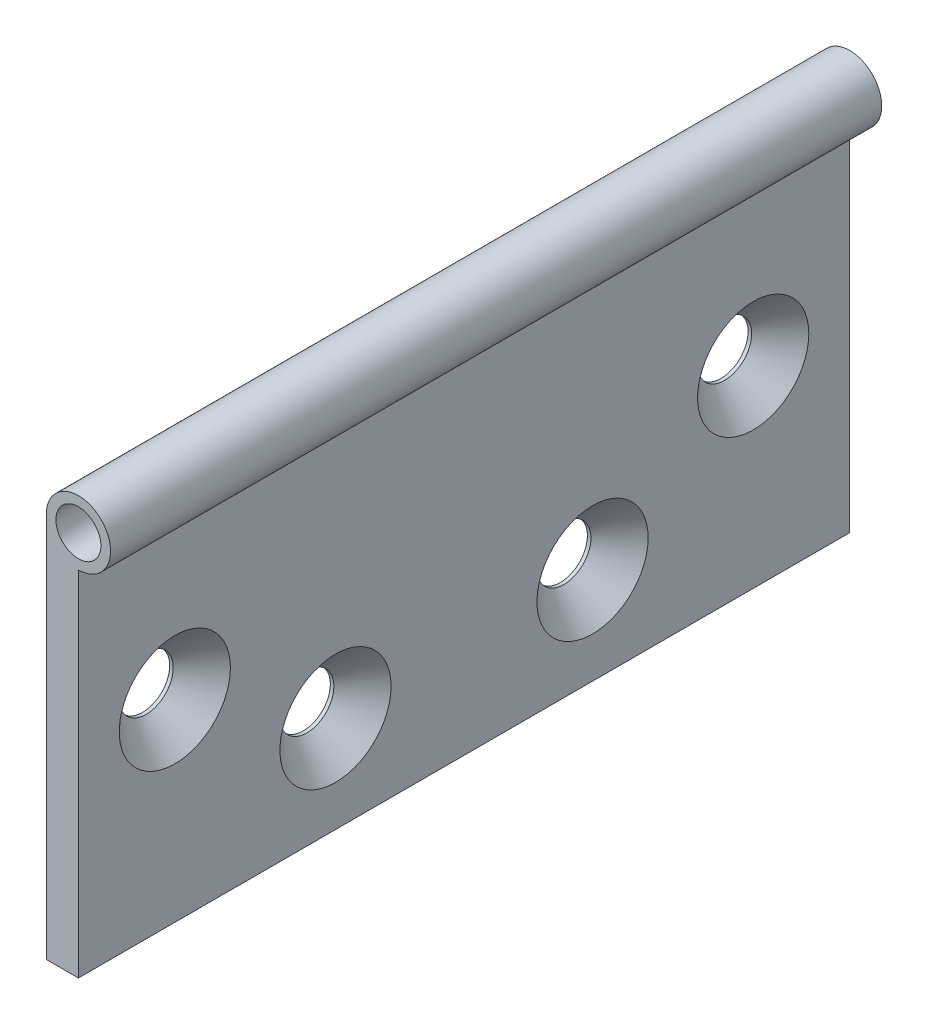
ISO-10303-21;
HEADER;
FILE_DESCRIPTION(('STEP AP214'),'2;1');
FILE_NAME('part.step','',(''),(''),'','','');
FILE_SCHEMA(('AUTOMOTIVE_DESIGN { 1 0 10303 214 1 1 1 1 }'));
ENDSEC;
DATA;
#1=APPLICATION_CONTEXT('core data for automotive mechanical design processes');
#2=APPLICATION_PROTOCOL_DEFINITION('international standard','automotive_design',2000,#1);
#3=PRODUCT_CONTEXT('',#1,'mechanical');
#4=PRODUCT('Part','Part','',(#3));
#5=PRODUCT_RELATED_PRODUCT_CATEGORY('part','',(#4));
#6=PRODUCT_DEFINITION_FORMATION('','',#4);
#7=PRODUCT_DEFINITION_CONTEXT('part definition',#1,'design');
#8=PRODUCT_DEFINITION('design','',#6,#7);
#9=PRODUCT_DEFINITION_SHAPE('','',#8);
#10=(LENGTH_UNIT() NAMED_UNIT(*) SI_UNIT(.MILLI.,.METRE.));
#11=(NAMED_UNIT(*) PLANE_ANGLE_UNIT() SI_UNIT($,.RADIAN.));
#12=(NAMED_UNIT(*) SI_UNIT($,.STERADIAN.) SOLID_ANGLE_UNIT());
#13=UNCERTAINTY_MEASURE_WITH_UNIT(LENGTH_MEASURE(1.E-05),#10,'distance_accuracy_value','');
#14=(GEOMETRIC_REPRESENTATION_CONTEXT(3) GLOBAL_UNCERTAINTY_ASSIGNED_CONTEXT((#13)) GLOBAL_UNIT_ASSIGNED_CONTEXT((#10,
#11,#12)) REPRESENTATION_CONTEXT('',''));
#15=CARTESIAN_POINT('',(0.,0.,0.));
#16=DIRECTION('',(0.,0.,1.));
#17=DIRECTION('',(1.,0.,0.));
#18=AXIS2_PLACEMENT_3D('',#15,#16,#17);
#19=CARTESIAN_POINT('',(5.,0.,60.));
#20=DIRECTION('',(-1.,0.,0.));
#21=DIRECTION('',(0.,0.,1.));
#22=AXIS2_PLACEMENT_3D('',#19,#20,#21);
#23=PLANE('',#22);
#24=CARTESIAN_POINT('',(5.,15.,-20.));
#25=DIRECTION('',(1.,0.,0.));
#26=DIRECTION('',(0.,0.,-1.));
#27=AXIS2_PLACEMENT_3D('',#24,#25,#26);
#28=CIRCLE('',#27,8.65);
#29=CARTESIAN_POINT('',(5.,15.,-28.65));
#30=VERTEX_POINT('',#29);
#31=EDGE_CURVE('E139',#30,#30,#28,.T.);
#32=ORIENTED_EDGE('',*,*,#31,.F.);
#33=EDGE_LOOP('',(#32));
#34=FACE_BOUND('',#33,.T.);
#35=CARTESIAN_POINT('',(5.,30.,-45.));
#36=DIRECTION('',(1.,0.,0.));
#37=DIRECTION('',(0.,0.,-1.));
#38=AXIS2_PLACEMENT_3D('',#35,#36,#37);
#39=CIRCLE('',#38,8.65);
#40=CARTESIAN_POINT('',(5.,30.,-53.65));
#41=VERTEX_POINT('',#40);
#42=EDGE_CURVE('E130',#41,#41,#39,.T.);
#43=ORIENTED_EDGE('',*,*,#42,.F.);
#44=EDGE_LOOP('',(#43));
#45=FACE_BOUND('',#44,.T.);
#46=CARTESIAN_POINT('',(5.,15.,20.));
#47=DIRECTION('',(1.,0.,0.));
#48=DIRECTION('',(0.,0.,-1.));
#49=AXIS2_PLACEMENT_3D('',#46,#47,#48);
#50=CIRCLE('',#49,8.65);
#51=CARTESIAN_POINT('',(5.,15.,11.35));
#52=VERTEX_POINT('',#51);
#53=EDGE_CURVE('E121',#52,#52,#50,.T.);
#54=ORIENTED_EDGE('',*,*,#53,.F.);
#55=EDGE_LOOP('',(#54));
#56=FACE_BOUND('',#55,.T.);
#57=CARTESIAN_POINT('',(5.,30.,45.));
#58=DIRECTION('',(1.,0.,0.));
#59=DIRECTION('',(0.,0.,-1.));
#60=AXIS2_PLACEMENT_3D('',#57,#58,#59);
#61=CIRCLE('',#60,8.65);
#62=CARTESIAN_POINT('',(5.,30.,36.35));
#63=VERTEX_POINT('',#62);
#64=EDGE_CURVE('E112',#63,#63,#61,.T.);
#65=ORIENTED_EDGE('',*,*,#64,.F.);
#66=EDGE_LOOP('',(#65));
#67=FACE_BOUND('',#66,.T.);
#68=DIRECTION('',(0.,0.,-1.));
#69=VECTOR('',#68,1.);
#70=CARTESIAN_POINT('',(5.,55.,60.));
#71=LINE('',#70,#69);
#72=CARTESIAN_POINT('',(5.,55.,60.));
#73=VERTEX_POINT('',#72);
#74=CARTESIAN_POINT('',(5.,55.,-60.));
#75=VERTEX_POINT('',#74);
#76=EDGE_CURVE('E83',#73,#75,#71,.T.);
#77=ORIENTED_EDGE('',*,*,#76,.F.);
#78=DIRECTION('',(0.,1.,0.));
#79=VECTOR('',#78,1.);
#80=CARTESIAN_POINT('',(5.,0.,60.));
#81=LINE('',#80,#79);
#82=CARTESIAN_POINT('',(5.,0.,60.));
#83=VERTEX_POINT('',#82);
#84=EDGE_CURVE('E71',#83,#73,#81,.T.);
#85=ORIENTED_EDGE('',*,*,#84,.F.);
#86=DIRECTION('',(0.,0.,-1.));
#87=VECTOR('',#86,1.);
#88=CARTESIAN_POINT('',(5.,0.,60.));
#89=LINE('',#88,#87);
#90=CARTESIAN_POINT('',(5.,0.,-60.));
#91=VERTEX_POINT('',#90);
#92=EDGE_CURVE('E52',#83,#91,#89,.T.);
#93=ORIENTED_EDGE('',*,*,#92,.T.);
#94=DIRECTION('',(0.,1.,0.));
#95=VECTOR('',#94,1.);
#96=CARTESIAN_POINT('',(5.,0.,-60.));
#97=LINE('',#96,#95);
#98=EDGE_CURVE('E69',#91,#75,#97,.T.);
#99=ORIENTED_EDGE('',*,*,#98,.T.);
#100=EDGE_LOOP('',(#77,#85,#93,#99));
#101=FACE_BOUND('',#100,.T.);
#102=ADVANCED_FACE('F36',(#34,#45,#56,#67,#101),#23,.F.);
#103=CARTESIAN_POINT('',(0.,0.,60.));
#104=DIRECTION('',(-1.,0.,0.));
#105=DIRECTION('',(0.,0.,1.));
#106=AXIS2_PLACEMENT_3D('',#103,#104,#105);
#107=PLANE('',#106);
#108=CARTESIAN_POINT('',(0.,15.,-20.));
#109=DIRECTION('',(1.,0.,0.));
#110=DIRECTION('',(0.,0.,-1.));
#111=AXIS2_PLACEMENT_3D('',#108,#109,#110);
#112=CIRCLE('',#111,4.2);
#113=CARTESIAN_POINT('',(0.,15.,-24.2));
#114=VERTEX_POINT('',#113);
#115=EDGE_CURVE('E133',#114,#114,#112,.T.);
#116=ORIENTED_EDGE('',*,*,#115,.T.);
#117=EDGE_LOOP('',(#116));
#118=FACE_BOUND('',#117,.T.);
#119=CARTESIAN_POINT('',(0.,30.,-45.));
#120=DIRECTION('',(1.,0.,0.));
#121=DIRECTION('',(0.,0.,-1.));
#122=AXIS2_PLACEMENT_3D('',#119,#120,#121);
#123=CIRCLE('',#122,4.2);
#124=CARTESIAN_POINT('',(0.,30.,-49.2));
#125=VERTEX_POINT('',#124);
#126=EDGE_CURVE('E124',#125,#125,#123,.T.);
#127=ORIENTED_EDGE('',*,*,#126,.T.);
#128=EDGE_LOOP('',(#127));
#129=FACE_BOUND('',#128,.T.);
#130=CARTESIAN_POINT('',(0.,15.,20.));
#131=DIRECTION('',(1.,0.,0.));
#132=DIRECTION('',(0.,0.,-1.));
#133=AXIS2_PLACEMENT_3D('',#130,#131,#132);
#134=CIRCLE('',#133,4.2);
#135=CARTESIAN_POINT('',(0.,15.,15.8));
#136=VERTEX_POINT('',#135);
#137=EDGE_CURVE('E115',#136,#136,#134,.T.);
#138=ORIENTED_EDGE('',*,*,#137,.T.);
#139=EDGE_LOOP('',(#138));
#140=FACE_BOUND('',#139,.T.);
#141=CARTESIAN_POINT('',(0.,30.,45.));
#142=DIRECTION('',(1.,0.,0.));
#143=DIRECTION('',(0.,0.,-1.));
#144=AXIS2_PLACEMENT_3D('',#141,#142,#143);
#145=CIRCLE('',#144,4.2);
#146=CARTESIAN_POINT('',(0.,30.,40.8));
#147=VERTEX_POINT('',#146);
#148=EDGE_CURVE('E104',#147,#147,#145,.T.);
#149=ORIENTED_EDGE('',*,*,#148,.T.);
#150=EDGE_LOOP('',(#149));
#151=FACE_BOUND('',#150,.T.);
#152=DIRECTION('',(0.,1.,0.));
#153=VECTOR('',#152,1.);
#154=CARTESIAN_POINT('',(0.,0.,-60.));
#155=LINE('',#154,#153);
#156=CARTESIAN_POINT('',(0.,0.,-60.));
#157=VERTEX_POINT('',#156);
#158=CARTESIAN_POINT('',(0.,60.,-60.));
#159=VERTEX_POINT('',#158);
#160=EDGE_CURVE('E82',#157,#159,#155,.T.);
#161=ORIENTED_EDGE('',*,*,#160,.F.);
#162=DIRECTION('',(0.,0.,-1.));
#163=VECTOR('',#162,1.);
#164=CARTESIAN_POINT('',(0.,0.,60.));
#165=LINE('',#164,#163);
#166=CARTESIAN_POINT('',(0.,0.,60.));
#167=VERTEX_POINT('',#166);
#168=EDGE_CURVE('E44',#167,#157,#165,.T.);
#169=ORIENTED_EDGE('',*,*,#168,.F.);
#170=DIRECTION('',(0.,1.,0.));
#171=VECTOR('',#170,1.);
#172=CARTESIAN_POINT('',(0.,0.,60.));
#173=LINE('',#172,#171);
#174=CARTESIAN_POINT('',(0.,60.,60.));
#175=VERTEX_POINT('',#174);
#176=EDGE_CURVE('E87',#167,#175,#173,.T.);
#177=ORIENTED_EDGE('',*,*,#176,.T.);
#178=DIRECTION('',(0.,0.,-1.));
#179=VECTOR('',#178,1.);
#180=CARTESIAN_POINT('',(0.,60.,60.));
#181=LINE('',#180,#179);
#182=EDGE_CURVE('E11',#175,#159,#181,.T.);
#183=ORIENTED_EDGE('',*,*,#182,.T.);
#184=EDGE_LOOP('',(#161,#169,#177,#183));
#185=FACE_BOUND('',#184,.T.);
#186=ADVANCED_FACE('F147',(#118,#129,#140,#151,#185),#107,.T.);
#187=CARTESIAN_POINT('',(5.,0.,60.));
#188=DIRECTION('',(0.,-1.,0.));
#189=DIRECTION('',(0.,0.,-1.));
#190=AXIS2_PLACEMENT_3D('',#187,#188,#189);
#191=PLANE('',#190);
#192=DIRECTION('',(-1.,0.,0.));
#193=VECTOR('',#192,1.);
#194=CARTESIAN_POINT('',(5.,0.,-60.));
#195=LINE('',#194,#193);
#196=EDGE_CURVE('E80',#91,#157,#195,.T.);
#197=ORIENTED_EDGE('',*,*,#196,.F.);
#198=ORIENTED_EDGE('',*,*,#92,.F.);
#199=DIRECTION('',(-1.,0.,0.));
#200=VECTOR('',#199,1.);
#201=CARTESIAN_POINT('',(5.,0.,60.));
#202=LINE('',#201,#200);
#203=EDGE_CURVE('E73',#83,#167,#202,.T.);
#204=ORIENTED_EDGE('',*,*,#203,.T.);
#205=ORIENTED_EDGE('',*,*,#168,.T.);
#206=EDGE_LOOP('',(#197,#198,#204,#205));
#207=FACE_BOUND('',#206,.T.);
#208=ADVANCED_FACE('F85',(#207),#191,.T.);
#209=CARTESIAN_POINT('',(0.,0.,60.));
#210=DIRECTION('',(0.,0.,-1.));
#211=DIRECTION('',(-1.,0.,0.));
#212=AXIS2_PLACEMENT_3D('',#209,#210,#211);
#213=PLANE('',#212);
#214=CARTESIAN_POINT('',(5.,60.,60.));
#215=DIRECTION('',(0.,0.,1.));
#216=DIRECTION('',(1.,0.,0.));
#217=AXIS2_PLACEMENT_3D('',#214,#215,#216);
#218=CIRCLE('',#217,3.5);
#219=CARTESIAN_POINT('',(8.5,60.,60.));
#220=VERTEX_POINT('',#219);
#221=EDGE_CURVE('E101',#220,#220,#218,.T.);
#222=ORIENTED_EDGE('',*,*,#221,.F.);
#223=EDGE_LOOP('',(#222));
#224=FACE_BOUND('',#223,.T.);
#225=ORIENTED_EDGE('',*,*,#84,.T.);
#226=CARTESIAN_POINT('',(5.,60.,60.));
#227=DIRECTION('',(0.,0.,1.));
#228=DIRECTION('',(1.,0.,0.));
#229=AXIS2_PLACEMENT_3D('',#226,#227,#228);
#230=CIRCLE('',#229,5.);
#231=EDGE_CURVE('E97',#73,#175,#230,.T.);
#232=ORIENTED_EDGE('',*,*,#231,.T.);
#233=ORIENTED_EDGE('',*,*,#176,.F.);
#234=ORIENTED_EDGE('',*,*,#203,.F.);
#235=EDGE_LOOP('',(#225,#232,#233,#234));
#236=FACE_BOUND('',#235,.T.);
#237=ADVANCED_FACE('F180',(#224,#236),#213,.F.);
#238=CARTESIAN_POINT('',(0.,0.,-60.));
#239=DIRECTION('',(0.,0.,-1.));
#240=DIRECTION('',(-1.,0.,0.));
#241=AXIS2_PLACEMENT_3D('',#238,#239,#240);
#242=PLANE('',#241);
#243=CARTESIAN_POINT('',(5.,60.,-60.));
#244=DIRECTION('',(0.,0.,1.));
#245=DIRECTION('',(1.,0.,0.));
#246=AXIS2_PLACEMENT_3D('',#243,#244,#245);
#247=CIRCLE('',#246,3.5);
#248=CARTESIAN_POINT('',(8.5,60.,-60.));
#249=VERTEX_POINT('',#248);
#250=EDGE_CURVE('E100',#249,#249,#247,.T.);
#251=ORIENTED_EDGE('',*,*,#250,.T.);
#252=EDGE_LOOP('',(#251));
#253=FACE_BOUND('',#252,.T.);
#254=ORIENTED_EDGE('',*,*,#160,.T.);
#255=CARTESIAN_POINT('',(5.,60.,-60.));
#256=DIRECTION('',(0.,0.,1.));
#257=DIRECTION('',(1.,0.,0.));
#258=AXIS2_PLACEMENT_3D('',#255,#256,#257);
#259=CIRCLE('',#258,5.);
#260=EDGE_CURVE('E81',#75,#159,#259,.T.);
#261=ORIENTED_EDGE('',*,*,#260,.F.);
#262=ORIENTED_EDGE('',*,*,#98,.F.);
#263=ORIENTED_EDGE('',*,*,#196,.T.);
#264=EDGE_LOOP('',(#254,#261,#262,#263));
#265=FACE_BOUND('',#264,.T.);
#266=ADVANCED_FACE('F79',(#253,#265),#242,.T.);
#267=CARTESIAN_POINT('',(5.,60.,60.));
#268=DIRECTION('',(0.,0.,-1.));
#269=DIRECTION('',(-1.,0.,0.));
#270=AXIS2_PLACEMENT_3D('',#267,#268,#269);
#271=CYLINDRICAL_SURFACE('',#270,5.);
#272=ORIENTED_EDGE('',*,*,#231,.F.);
#273=ORIENTED_EDGE('',*,*,#76,.T.);
#274=ORIENTED_EDGE('',*,*,#260,.T.);
#275=ORIENTED_EDGE('',*,*,#182,.F.);
#276=EDGE_LOOP('',(#272,#273,#274,#275));
#277=FACE_BOUND('',#276,.T.);
#278=ADVANCED_FACE('F175',(#277),#271,.T.);
#279=CARTESIAN_POINT('',(5.,60.,-60.));
#280=DIRECTION('',(0.,0.,1.));
#281=DIRECTION('',(1.,0.,0.));
#282=AXIS2_PLACEMENT_3D('',#279,#280,#281);
#283=CYLINDRICAL_SURFACE('',#282,3.5);
#284=ORIENTED_EDGE('',*,*,#250,.F.);
#285=EDGE_LOOP('',(#284));
#286=FACE_BOUND('',#285,.T.);
#287=ORIENTED_EDGE('',*,*,#221,.T.);
#288=EDGE_LOOP('',(#287));
#289=FACE_BOUND('',#288,.T.);
#290=ADVANCED_FACE('F167',(#286,#289),#283,.F.);
#291=CARTESIAN_POINT('',(5.,30.,45.));
#292=DIRECTION('',(1.,0.,0.));
#293=DIRECTION('',(0.,0.,-1.));
#294=AXIS2_PLACEMENT_3D('',#291,#292,#293);
#295=CYLINDRICAL_SURFACE('',#294,4.2);
#296=ORIENTED_EDGE('',*,*,#148,.F.);
#297=EDGE_LOOP('',(#296));
#298=FACE_BOUND('',#297,.T.);
#299=CARTESIAN_POINT('',(0.550000000000001,30.,45.));
#300=DIRECTION('',(1.,0.,0.));
#301=DIRECTION('',(0.,0.,-1.));
#302=AXIS2_PLACEMENT_3D('',#299,#300,#301);
#303=CIRCLE('',#302,4.2);
#304=CARTESIAN_POINT('',(0.550000000000001,30.,40.8));
#305=VERTEX_POINT('',#304);
#306=EDGE_CURVE('E109',#305,#305,#303,.T.);
#307=ORIENTED_EDGE('',*,*,#306,.T.);
#308=EDGE_LOOP('',(#307));
#309=FACE_BOUND('',#308,.T.);
#310=ADVANCED_FACE('F157',(#298,#309),#295,.F.);
#311=CARTESIAN_POINT('',(5.,30.,45.));
#312=DIRECTION('',(1.,0.,0.));
#313=DIRECTION('',(0.,0.,-1.));
#314=AXIS2_PLACEMENT_3D('',#311,#312,#313);
#315=CONICAL_SURFACE('',#314,8.65,0.785398163397448);
#316=ORIENTED_EDGE('',*,*,#306,.F.);
#317=EDGE_LOOP('',(#316));
#318=FACE_BOUND('',#317,.T.);
#319=ORIENTED_EDGE('',*,*,#64,.T.);
#320=EDGE_LOOP('',(#319));
#321=FACE_BOUND('',#320,.T.);
#322=ADVANCED_FACE('F154',(#318,#321),#315,.F.);
#323=CARTESIAN_POINT('',(5.,15.,20.));
#324=DIRECTION('',(1.,0.,0.));
#325=DIRECTION('',(0.,0.,-1.));
#326=AXIS2_PLACEMENT_3D('',#323,#324,#325);
#327=CYLINDRICAL_SURFACE('',#326,4.2);
#328=ORIENTED_EDGE('',*,*,#137,.F.);
#329=EDGE_LOOP('',(#328));
#330=FACE_BOUND('',#329,.T.);
#331=CARTESIAN_POINT('',(0.550000000000001,15.,20.));
#332=DIRECTION('',(1.,0.,0.));
#333=DIRECTION('',(0.,0.,-1.));
#334=AXIS2_PLACEMENT_3D('',#331,#332,#333);
#335=CIRCLE('',#334,4.2);
#336=CARTESIAN_POINT('',(0.550000000000001,15.,15.8));
#337=VERTEX_POINT('',#336);
#338=EDGE_CURVE('E118',#337,#337,#335,.T.);
#339=ORIENTED_EDGE('',*,*,#338,.T.);
#340=EDGE_LOOP('',(#339));
#341=FACE_BOUND('',#340,.T.);
#342=ADVANCED_FACE('F156',(#330,#341),#327,.F.);
#343=CARTESIAN_POINT('',(5.,15.,20.));
#344=DIRECTION('',(1.,0.,0.));
#345=DIRECTION('',(0.,0.,-1.));
#346=AXIS2_PLACEMENT_3D('',#343,#344,#345);
#347=CONICAL_SURFACE('',#346,8.65,0.785398163397448);
#348=ORIENTED_EDGE('',*,*,#338,.F.);
#349=EDGE_LOOP('',(#348));
#350=FACE_BOUND('',#349,.T.);
#351=ORIENTED_EDGE('',*,*,#53,.T.);
#352=EDGE_LOOP('',(#351));
#353=FACE_BOUND('',#352,.T.);
#354=ADVANCED_FACE('F164',(#350,#353),#347,.F.);
#355=CARTESIAN_POINT('',(5.,30.,-45.));
#356=DIRECTION('',(1.,0.,0.));
#357=DIRECTION('',(0.,0.,-1.));
#358=AXIS2_PLACEMENT_3D('',#355,#356,#357);
#359=CYLINDRICAL_SURFACE('',#358,4.2);
#360=ORIENTED_EDGE('',*,*,#126,.F.);
#361=EDGE_LOOP('',(#360));
#362=FACE_BOUND('',#361,.T.);
#363=CARTESIAN_POINT('',(0.550000000000001,30.,-45.));
#364=DIRECTION('',(1.,0.,0.));
#365=DIRECTION('',(0.,0.,-1.));
#366=AXIS2_PLACEMENT_3D('',#363,#364,#365);
#367=CIRCLE('',#366,4.2);
#368=CARTESIAN_POINT('',(0.550000000000001,30.,-49.2));
#369=VERTEX_POINT('',#368);
#370=EDGE_CURVE('E127',#369,#369,#367,.T.);
#371=ORIENTED_EDGE('',*,*,#370,.T.);
#372=EDGE_LOOP('',(#371));
#373=FACE_BOUND('',#372,.T.);
#374=ADVANCED_FACE('F213',(#362,#373),#359,.F.);
#375=CARTESIAN_POINT('',(5.,30.,-45.));
#376=DIRECTION('',(1.,0.,0.));
#377=DIRECTION('',(0.,0.,-1.));
#378=AXIS2_PLACEMENT_3D('',#375,#376,#377);
#379=CONICAL_SURFACE('',#378,8.65,0.785398163397448);
#380=ORIENTED_EDGE('',*,*,#370,.F.);
#381=EDGE_LOOP('',(#380));
#382=FACE_BOUND('',#381,.T.);
#383=ORIENTED_EDGE('',*,*,#42,.T.);
#384=EDGE_LOOP('',(#383));
#385=FACE_BOUND('',#384,.T.);
#386=ADVANCED_FACE('F217',(#382,#385),#379,.F.);
#387=CARTESIAN_POINT('',(5.,15.,-20.));
#388=DIRECTION('',(1.,0.,0.));
#389=DIRECTION('',(0.,0.,-1.));
#390=AXIS2_PLACEMENT_3D('',#387,#388,#389);
#391=CYLINDRICAL_SURFACE('',#390,4.2);
#392=ORIENTED_EDGE('',*,*,#115,.F.);
#393=EDGE_LOOP('',(#392));
#394=FACE_BOUND('',#393,.T.);
#395=CARTESIAN_POINT('',(0.550000000000001,15.,-20.));
#396=DIRECTION('',(1.,0.,0.));
#397=DIRECTION('',(0.,0.,-1.));
#398=AXIS2_PLACEMENT_3D('',#395,#396,#397);
#399=CIRCLE('',#398,4.2);
#400=CARTESIAN_POINT('',(0.550000000000001,15.,-24.2));
#401=VERTEX_POINT('',#400);
#402=EDGE_CURVE('E136',#401,#401,#399,.T.);
#403=ORIENTED_EDGE('',*,*,#402,.T.);
#404=EDGE_LOOP('',(#403));
#405=FACE_BOUND('',#404,.T.);
#406=ADVANCED_FACE('F223',(#394,#405),#391,.F.);
#407=CARTESIAN_POINT('',(5.,15.,-20.));
#408=DIRECTION('',(1.,0.,0.));
#409=DIRECTION('',(0.,0.,-1.));
#410=AXIS2_PLACEMENT_3D('',#407,#408,#409);
#411=CONICAL_SURFACE('',#410,8.65,0.785398163397448);
#412=ORIENTED_EDGE('',*,*,#402,.F.);
#413=EDGE_LOOP('',(#412));
#414=FACE_BOUND('',#413,.T.);
#415=ORIENTED_EDGE('',*,*,#31,.T.);
#416=EDGE_LOOP('',(#415));
#417=FACE_BOUND('',#416,.T.);
#418=ADVANCED_FACE('F143',(#414,#417),#411,.F.);
#419=CLOSED_SHELL('',(#102,#186,#208,#237,#266,#278,#290,#310,#322,#342,#354,#374,#386,#406,#418));
#420=MANIFOLD_SOLID_BREP('B2',#419);
#421=ADVANCED_BREP_SHAPE_REPRESENTATION('',(#18,#420),#14);
#422=SHAPE_DEFINITION_REPRESENTATION(#9,#421);
ENDSEC;
END-ISO-10303-21;
